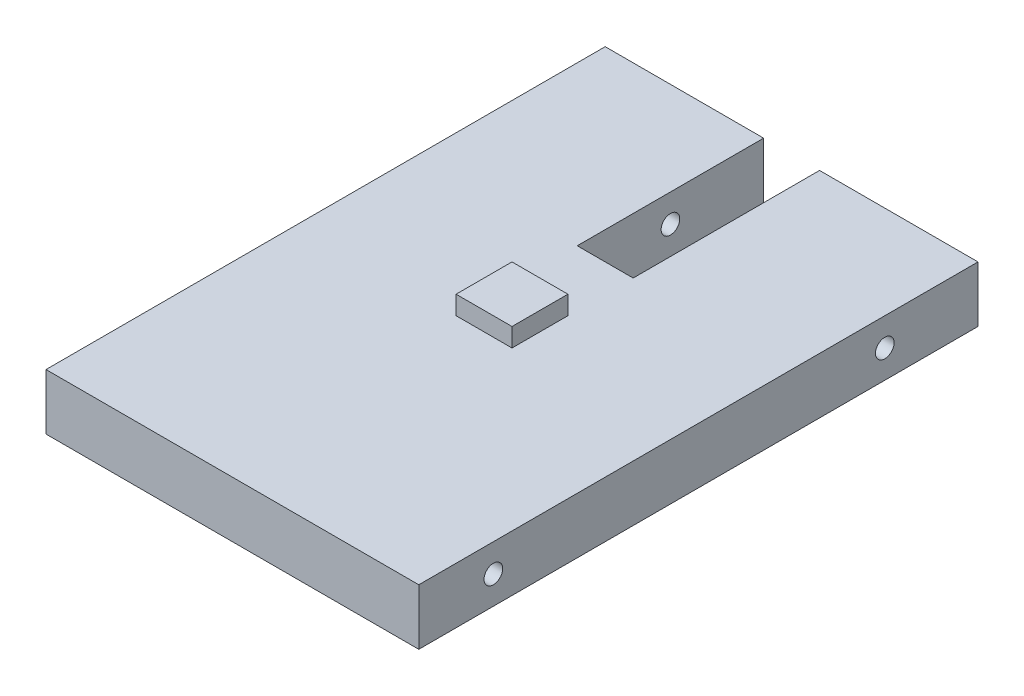
ISO-10303-21;
HEADER;
FILE_DESCRIPTION(('STEP AP214'),'2;1');
FILE_NAME('part.step','',(''),(''),'','','');
FILE_SCHEMA(('AUTOMOTIVE_DESIGN { 1 0 10303 214 1 1 1 1 }'));
ENDSEC;
DATA;
#1=APPLICATION_CONTEXT('core data for automotive mechanical design processes');
#2=APPLICATION_PROTOCOL_DEFINITION('international standard','automotive_design',2000,#1);
#3=PRODUCT_CONTEXT('',#1,'mechanical');
#4=PRODUCT('Part','Part','',(#3));
#5=PRODUCT_RELATED_PRODUCT_CATEGORY('part','',(#4));
#6=PRODUCT_DEFINITION_FORMATION('','',#4);
#7=PRODUCT_DEFINITION_CONTEXT('part definition',#1,'design');
#8=PRODUCT_DEFINITION('design','',#6,#7);
#9=PRODUCT_DEFINITION_SHAPE('','',#8);
#10=(LENGTH_UNIT() NAMED_UNIT(*) SI_UNIT(.MILLI.,.METRE.));
#11=(NAMED_UNIT(*) PLANE_ANGLE_UNIT() SI_UNIT($,.RADIAN.));
#12=(NAMED_UNIT(*) SI_UNIT($,.STERADIAN.) SOLID_ANGLE_UNIT());
#13=UNCERTAINTY_MEASURE_WITH_UNIT(LENGTH_MEASURE(1.E-05),#10,'distance_accuracy_value','');
#14=(GEOMETRIC_REPRESENTATION_CONTEXT(3) GLOBAL_UNCERTAINTY_ASSIGNED_CONTEXT((#13)) GLOBAL_UNIT_ASSIGNED_CONTEXT((#10,
#11,#12)) REPRESENTATION_CONTEXT('',''));
#15=CARTESIAN_POINT('',(0.,0.,0.));
#16=DIRECTION('',(0.,0.,1.));
#17=DIRECTION('',(1.,0.,0.));
#18=AXIS2_PLACEMENT_3D('',#15,#16,#17);
#19=CARTESIAN_POINT('',(0.,30.,0.));
#20=DIRECTION('',(0.,1.,0.));
#21=DIRECTION('',(0.,0.,1.));
#22=AXIS2_PLACEMENT_3D('',#19,#20,#21);
#23=PLANE('',#22);
#24=DIRECTION('',(-1.,0.,0.));
#25=VECTOR('',#24,1.);
#26=CARTESIAN_POINT('',(15.,30.,-150.));
#27=LINE('',#26,#25);
#28=CARTESIAN_POINT('',(100.,30.,-150.));
#29=VERTEX_POINT('',#28);
#30=CARTESIAN_POINT('',(15.,30.,-150.));
#31=VERTEX_POINT('',#30);
#32=EDGE_CURVE('E160',#29,#31,#27,.T.);
#33=ORIENTED_EDGE('',*,*,#32,.T.);
#34=DIRECTION('',(0.,0.,1.));
#35=VECTOR('',#34,1.);
#36=CARTESIAN_POINT('',(15.,30.,-50.));
#37=LINE('',#36,#35);
#38=CARTESIAN_POINT('',(15.,30.,-50.));
#39=VERTEX_POINT('',#38);
#40=EDGE_CURVE('E100',#31,#39,#37,.T.);
#41=ORIENTED_EDGE('',*,*,#40,.T.);
#42=DIRECTION('',(-1.,0.,0.));
#43=VECTOR('',#42,1.);
#44=CARTESIAN_POINT('',(-15.,30.,-50.));
#45=LINE('',#44,#43);
#46=CARTESIAN_POINT('',(-15.,30.,-50.));
#47=VERTEX_POINT('',#46);
#48=EDGE_CURVE('E195',#39,#47,#45,.T.);
#49=ORIENTED_EDGE('',*,*,#48,.T.);
#50=DIRECTION('',(0.,0.,-1.));
#51=VECTOR('',#50,1.);
#52=CARTESIAN_POINT('',(-15.,30.,-150.));
#53=LINE('',#52,#51);
#54=CARTESIAN_POINT('',(-15.,30.,-150.));
#55=VERTEX_POINT('',#54);
#56=EDGE_CURVE('E197',#47,#55,#53,.T.);
#57=ORIENTED_EDGE('',*,*,#56,.T.);
#58=DIRECTION('',(-1.,0.,0.));
#59=VECTOR('',#58,1.);
#60=CARTESIAN_POINT('',(-100.,30.,-150.));
#61=LINE('',#60,#59);
#62=CARTESIAN_POINT('',(-100.,30.,-150.));
#63=VERTEX_POINT('',#62);
#64=EDGE_CURVE('E123',#55,#63,#61,.T.);
#65=ORIENTED_EDGE('',*,*,#64,.T.);
#66=DIRECTION('',(0.,0.,1.));
#67=VECTOR('',#66,1.);
#68=CARTESIAN_POINT('',(-100.,30.,150.));
#69=LINE('',#68,#67);
#70=CARTESIAN_POINT('',(-100.,30.,150.));
#71=VERTEX_POINT('',#70);
#72=EDGE_CURVE('E116',#63,#71,#69,.T.);
#73=ORIENTED_EDGE('',*,*,#72,.T.);
#74=DIRECTION('',(1.,0.,0.));
#75=VECTOR('',#74,1.);
#76=CARTESIAN_POINT('',(-100.,30.,150.));
#77=LINE('',#76,#75);
#78=CARTESIAN_POINT('',(100.,30.,150.));
#79=VERTEX_POINT('',#78);
#80=EDGE_CURVE('E120',#71,#79,#77,.T.);
#81=ORIENTED_EDGE('',*,*,#80,.T.);
#82=DIRECTION('',(0.,0.,-1.));
#83=VECTOR('',#82,1.);
#84=CARTESIAN_POINT('',(100.,30.,150.));
#85=LINE('',#84,#83);
#86=EDGE_CURVE('E59',#79,#29,#85,.T.);
#87=ORIENTED_EDGE('',*,*,#86,.T.);
#88=EDGE_LOOP('',(#33,#41,#49,#57,#65,#73,#81,#87));
#89=FACE_BOUND('',#88,.T.);
#90=DIRECTION('',(-1.,0.,0.));
#91=VECTOR('',#90,1.);
#92=CARTESIAN_POINT('',(-15.,30.,-15.));
#93=LINE('',#92,#91);
#94=CARTESIAN_POINT('',(15.,30.,-15.));
#95=VERTEX_POINT('',#94);
#96=CARTESIAN_POINT('',(-15.,30.,-15.));
#97=VERTEX_POINT('',#96);
#98=EDGE_CURVE('E415',#95,#97,#93,.T.);
#99=ORIENTED_EDGE('',*,*,#98,.F.);
#100=DIRECTION('',(0.,0.,-1.));
#101=VECTOR('',#100,1.);
#102=CARTESIAN_POINT('',(15.,30.,15.));
#103=LINE('',#102,#101);
#104=CARTESIAN_POINT('',(15.,30.,15.));
#105=VERTEX_POINT('',#104);
#106=EDGE_CURVE('E400',#105,#95,#103,.T.);
#107=ORIENTED_EDGE('',*,*,#106,.F.);
#108=DIRECTION('',(1.,0.,0.));
#109=VECTOR('',#108,1.);
#110=CARTESIAN_POINT('',(-15.,30.,15.));
#111=LINE('',#110,#109);
#112=CARTESIAN_POINT('',(-15.,30.,15.));
#113=VERTEX_POINT('',#112);
#114=EDGE_CURVE('E394',#113,#105,#111,.T.);
#115=ORIENTED_EDGE('',*,*,#114,.F.);
#116=DIRECTION('',(0.,0.,1.));
#117=VECTOR('',#116,1.);
#118=CARTESIAN_POINT('',(-15.,30.,15.));
#119=LINE('',#118,#117);
#120=EDGE_CURVE('E413',#97,#113,#119,.T.);
#121=ORIENTED_EDGE('',*,*,#120,.F.);
#122=EDGE_LOOP('',(#99,#107,#115,#121));
#123=FACE_BOUND('',#122,.T.);
#124=ADVANCED_FACE('F33',(#89,#123),#23,.T.);
#125=CARTESIAN_POINT('',(15.,30.,-150.));
#126=DIRECTION('',(0.,0.,1.));
#127=DIRECTION('',(1.,0.,0.));
#128=AXIS2_PLACEMENT_3D('',#125,#126,#127);
#129=PLANE('',#128);
#130=DIRECTION('',(-1.,0.,0.));
#131=VECTOR('',#130,1.);
#132=CARTESIAN_POINT('',(15.,0.,-150.));
#133=LINE('',#132,#131);
#134=CARTESIAN_POINT('',(100.,0.,-150.));
#135=VERTEX_POINT('',#134);
#136=CARTESIAN_POINT('',(15.,0.,-150.));
#137=VERTEX_POINT('',#136);
#138=EDGE_CURVE('E144',#135,#137,#133,.T.);
#139=ORIENTED_EDGE('',*,*,#138,.T.);
#140=DIRECTION('',(0.,-1.,0.));
#141=VECTOR('',#140,1.);
#142=CARTESIAN_POINT('',(15.,30.,-150.));
#143=LINE('',#142,#141);
#144=EDGE_CURVE('E11',#31,#137,#143,.T.);
#145=ORIENTED_EDGE('',*,*,#144,.F.);
#146=ORIENTED_EDGE('',*,*,#32,.F.);
#147=DIRECTION('',(0.,-1.,0.));
#148=VECTOR('',#147,1.);
#149=CARTESIAN_POINT('',(100.,30.,-150.));
#150=LINE('',#149,#148);
#151=EDGE_CURVE('E140',#29,#135,#150,.T.);
#152=ORIENTED_EDGE('',*,*,#151,.T.);
#153=EDGE_LOOP('',(#139,#145,#146,#152));
#154=FACE_BOUND('',#153,.T.);
#155=ADVANCED_FACE('F35',(#154),#129,.F.);
#156=CARTESIAN_POINT('',(15.,30.,-50.));
#157=DIRECTION('',(1.,0.,0.));
#158=DIRECTION('',(0.,0.,-1.));
#159=AXIS2_PLACEMENT_3D('',#156,#157,#158);
#160=PLANE('',#159);
#161=CARTESIAN_POINT('',(15.,15.,-100.));
#162=DIRECTION('',(1.,0.,0.));
#163=DIRECTION('',(0.,0.,-1.));
#164=AXIS2_PLACEMENT_3D('',#161,#162,#163);
#165=CIRCLE('',#164,5.);
#166=CARTESIAN_POINT('',(15.,15.,-105.));
#167=VERTEX_POINT('',#166);
#168=EDGE_CURVE('E148',#167,#167,#165,.T.);
#169=ORIENTED_EDGE('',*,*,#168,.T.);
#170=EDGE_LOOP('',(#169));
#171=FACE_BOUND('',#170,.T.);
#172=DIRECTION('',(0.,0.,1.));
#173=VECTOR('',#172,1.);
#174=CARTESIAN_POINT('',(15.,0.,-50.));
#175=LINE('',#174,#173);
#176=CARTESIAN_POINT('',(15.,0.,-50.));
#177=VERTEX_POINT('',#176);
#178=EDGE_CURVE('E147',#137,#177,#175,.T.);
#179=ORIENTED_EDGE('',*,*,#178,.T.);
#180=DIRECTION('',(0.,-1.,0.));
#181=VECTOR('',#180,1.);
#182=CARTESIAN_POINT('',(15.,30.,-50.));
#183=LINE('',#182,#181);
#184=EDGE_CURVE('E42',#39,#177,#183,.T.);
#185=ORIENTED_EDGE('',*,*,#184,.F.);
#186=ORIENTED_EDGE('',*,*,#40,.F.);
#187=ORIENTED_EDGE('',*,*,#144,.T.);
#188=EDGE_LOOP('',(#179,#185,#186,#187));
#189=FACE_BOUND('',#188,.T.);
#190=ADVANCED_FACE('F215',(#171,#189),#160,.F.);
#191=CARTESIAN_POINT('',(-15.,30.,-50.));
#192=DIRECTION('',(0.,0.,1.));
#193=DIRECTION('',(1.,0.,0.));
#194=AXIS2_PLACEMENT_3D('',#191,#192,#193);
#195=PLANE('',#194);
#196=DIRECTION('',(-1.,0.,0.));
#197=VECTOR('',#196,1.);
#198=CARTESIAN_POINT('',(-15.,0.,-50.));
#199=LINE('',#198,#197);
#200=CARTESIAN_POINT('',(-15.,0.,-50.));
#201=VERTEX_POINT('',#200);
#202=EDGE_CURVE('E150',#177,#201,#199,.T.);
#203=ORIENTED_EDGE('',*,*,#202,.T.);
#204=DIRECTION('',(0.,-1.,0.));
#205=VECTOR('',#204,1.);
#206=CARTESIAN_POINT('',(-15.,30.,-50.));
#207=LINE('',#206,#205);
#208=EDGE_CURVE('E167',#47,#201,#207,.T.);
#209=ORIENTED_EDGE('',*,*,#208,.F.);
#210=ORIENTED_EDGE('',*,*,#48,.F.);
#211=ORIENTED_EDGE('',*,*,#184,.T.);
#212=EDGE_LOOP('',(#203,#209,#210,#211));
#213=FACE_BOUND('',#212,.T.);
#214=ADVANCED_FACE('F218',(#213),#195,.F.);
#215=CARTESIAN_POINT('',(-15.,30.,-150.));
#216=DIRECTION('',(-1.,0.,0.));
#217=DIRECTION('',(0.,0.,1.));
#218=AXIS2_PLACEMENT_3D('',#215,#216,#217);
#219=PLANE('',#218);
#220=CARTESIAN_POINT('',(-15.,15.,-100.));
#221=DIRECTION('',(-1.,0.,0.));
#222=DIRECTION('',(0.,0.,1.));
#223=AXIS2_PLACEMENT_3D('',#220,#221,#222);
#224=CIRCLE('',#223,5.);
#225=CARTESIAN_POINT('',(-15.,15.,-95.));
#226=VERTEX_POINT('',#225);
#227=EDGE_CURVE('E177',#226,#226,#224,.T.);
#228=ORIENTED_EDGE('',*,*,#227,.T.);
#229=EDGE_LOOP('',(#228));
#230=FACE_BOUND('',#229,.T.);
#231=DIRECTION('',(0.,0.,-1.));
#232=VECTOR('',#231,1.);
#233=CARTESIAN_POINT('',(-15.,0.,-150.));
#234=LINE('',#233,#232);
#235=CARTESIAN_POINT('',(-15.,0.,-150.));
#236=VERTEX_POINT('',#235);
#237=EDGE_CURVE('E152',#201,#236,#234,.T.);
#238=ORIENTED_EDGE('',*,*,#237,.T.);
#239=DIRECTION('',(0.,-1.,0.));
#240=VECTOR('',#239,1.);
#241=CARTESIAN_POINT('',(-15.,30.,-150.));
#242=LINE('',#241,#240);
#243=EDGE_CURVE('E164',#55,#236,#242,.T.);
#244=ORIENTED_EDGE('',*,*,#243,.F.);
#245=ORIENTED_EDGE('',*,*,#56,.F.);
#246=ORIENTED_EDGE('',*,*,#208,.T.);
#247=EDGE_LOOP('',(#238,#244,#245,#246));
#248=FACE_BOUND('',#247,.T.);
#249=ADVANCED_FACE('F203',(#230,#248),#219,.F.);
#250=CARTESIAN_POINT('',(-100.,30.,-150.));
#251=DIRECTION('',(0.,0.,1.));
#252=DIRECTION('',(1.,0.,0.));
#253=AXIS2_PLACEMENT_3D('',#250,#251,#252);
#254=PLANE('',#253);
#255=DIRECTION('',(-1.,0.,0.));
#256=VECTOR('',#255,1.);
#257=CARTESIAN_POINT('',(-100.,0.,-150.));
#258=LINE('',#257,#256);
#259=CARTESIAN_POINT('',(-100.,0.,-150.));
#260=VERTEX_POINT('',#259);
#261=EDGE_CURVE('E154',#236,#260,#258,.T.);
#262=ORIENTED_EDGE('',*,*,#261,.T.);
#263=DIRECTION('',(0.,-1.,0.));
#264=VECTOR('',#263,1.);
#265=CARTESIAN_POINT('',(-100.,30.,-150.));
#266=LINE('',#265,#264);
#267=EDGE_CURVE('E135',#63,#260,#266,.T.);
#268=ORIENTED_EDGE('',*,*,#267,.F.);
#269=ORIENTED_EDGE('',*,*,#64,.F.);
#270=ORIENTED_EDGE('',*,*,#243,.T.);
#271=EDGE_LOOP('',(#262,#268,#269,#270));
#272=FACE_BOUND('',#271,.T.);
#273=ADVANCED_FACE('F207',(#272),#254,.F.);
#274=CARTESIAN_POINT('',(-100.,30.,150.));
#275=DIRECTION('',(1.,0.,0.));
#276=DIRECTION('',(0.,0.,-1.));
#277=AXIS2_PLACEMENT_3D('',#274,#275,#276);
#278=PLANE('',#277);
#279=CARTESIAN_POINT('',(-100.,15.,-100.));
#280=DIRECTION('',(-1.,0.,0.));
#281=DIRECTION('',(0.,0.,1.));
#282=AXIS2_PLACEMENT_3D('',#279,#280,#281);
#283=CIRCLE('',#282,5.);
#284=CARTESIAN_POINT('',(-100.,15.,-95.));
#285=VERTEX_POINT('',#284);
#286=EDGE_CURVE('E173',#285,#285,#283,.T.);
#287=ORIENTED_EDGE('',*,*,#286,.F.);
#288=EDGE_LOOP('',(#287));
#289=FACE_BOUND('',#288,.T.);
#290=CARTESIAN_POINT('',(-100.,15.,110.));
#291=DIRECTION('',(-1.,0.,0.));
#292=DIRECTION('',(0.,0.,1.));
#293=AXIS2_PLACEMENT_3D('',#290,#291,#292);
#294=CIRCLE('',#293,5.);
#295=CARTESIAN_POINT('',(-100.,15.,115.));
#296=VERTEX_POINT('',#295);
#297=EDGE_CURVE('E179',#296,#296,#294,.T.);
#298=ORIENTED_EDGE('',*,*,#297,.F.);
#299=EDGE_LOOP('',(#298));
#300=FACE_BOUND('',#299,.T.);
#301=DIRECTION('',(0.,0.,1.));
#302=VECTOR('',#301,1.);
#303=CARTESIAN_POINT('',(-100.,0.,150.));
#304=LINE('',#303,#302);
#305=CARTESIAN_POINT('',(-100.,0.,150.));
#306=VERTEX_POINT('',#305);
#307=EDGE_CURVE('E132',#260,#306,#304,.T.);
#308=ORIENTED_EDGE('',*,*,#307,.T.);
#309=DIRECTION('',(0.,-1.,0.));
#310=VECTOR('',#309,1.);
#311=CARTESIAN_POINT('',(-100.,30.,150.));
#312=LINE('',#311,#310);
#313=EDGE_CURVE('E129',#71,#306,#312,.T.);
#314=ORIENTED_EDGE('',*,*,#313,.F.);
#315=ORIENTED_EDGE('',*,*,#72,.F.);
#316=ORIENTED_EDGE('',*,*,#267,.T.);
#317=EDGE_LOOP('',(#308,#314,#315,#316));
#318=FACE_BOUND('',#317,.T.);
#319=ADVANCED_FACE('F130',(#289,#300,#318),#278,.F.);
#320=CARTESIAN_POINT('',(-100.,30.,150.));
#321=DIRECTION('',(0.,0.,-1.));
#322=DIRECTION('',(-1.,0.,0.));
#323=AXIS2_PLACEMENT_3D('',#320,#321,#322);
#324=PLANE('',#323);
#325=DIRECTION('',(1.,0.,0.));
#326=VECTOR('',#325,1.);
#327=CARTESIAN_POINT('',(-100.,0.,150.));
#328=LINE('',#327,#326);
#329=CARTESIAN_POINT('',(100.,0.,150.));
#330=VERTEX_POINT('',#329);
#331=EDGE_CURVE('E157',#306,#330,#328,.T.);
#332=ORIENTED_EDGE('',*,*,#331,.T.);
#333=DIRECTION('',(0.,-1.,0.));
#334=VECTOR('',#333,1.);
#335=CARTESIAN_POINT('',(100.,30.,150.));
#336=LINE('',#335,#334);
#337=EDGE_CURVE('E136',#79,#330,#336,.T.);
#338=ORIENTED_EDGE('',*,*,#337,.F.);
#339=ORIENTED_EDGE('',*,*,#80,.F.);
#340=ORIENTED_EDGE('',*,*,#313,.T.);
#341=EDGE_LOOP('',(#332,#338,#339,#340));
#342=FACE_BOUND('',#341,.T.);
#343=ADVANCED_FACE('F138',(#342),#324,.F.);
#344=CARTESIAN_POINT('',(100.,30.,150.));
#345=DIRECTION('',(-1.,0.,0.));
#346=DIRECTION('',(0.,0.,1.));
#347=AXIS2_PLACEMENT_3D('',#344,#345,#346);
#348=PLANE('',#347);
#349=CARTESIAN_POINT('',(100.,15.,-100.));
#350=DIRECTION('',(-1.,0.,0.));
#351=DIRECTION('',(0.,0.,1.));
#352=AXIS2_PLACEMENT_3D('',#349,#350,#351);
#353=CIRCLE('',#352,5.);
#354=CARTESIAN_POINT('',(100.,15.,-95.));
#355=VERTEX_POINT('',#354);
#356=EDGE_CURVE('E37',#355,#355,#353,.T.);
#357=ORIENTED_EDGE('',*,*,#356,.T.);
#358=EDGE_LOOP('',(#357));
#359=FACE_BOUND('',#358,.T.);
#360=CARTESIAN_POINT('',(100.,15.,110.));
#361=DIRECTION('',(-1.,0.,0.));
#362=DIRECTION('',(0.,0.,1.));
#363=AXIS2_PLACEMENT_3D('',#360,#361,#362);
#364=CIRCLE('',#363,5.);
#365=CARTESIAN_POINT('',(100.,15.,115.));
#366=VERTEX_POINT('',#365);
#367=EDGE_CURVE('E171',#366,#366,#364,.T.);
#368=ORIENTED_EDGE('',*,*,#367,.T.);
#369=EDGE_LOOP('',(#368));
#370=FACE_BOUND('',#369,.T.);
#371=DIRECTION('',(0.,0.,-1.));
#372=VECTOR('',#371,1.);
#373=CARTESIAN_POINT('',(100.,0.,150.));
#374=LINE('',#373,#372);
#375=EDGE_CURVE('E92',#330,#135,#374,.T.);
#376=ORIENTED_EDGE('',*,*,#375,.T.);
#377=ORIENTED_EDGE('',*,*,#151,.F.);
#378=ORIENTED_EDGE('',*,*,#86,.F.);
#379=ORIENTED_EDGE('',*,*,#337,.T.);
#380=EDGE_LOOP('',(#376,#377,#378,#379));
#381=FACE_BOUND('',#380,.T.);
#382=ADVANCED_FACE('F211',(#359,#370,#381),#348,.F.);
#383=CARTESIAN_POINT('',(0.,0.,0.));
#384=DIRECTION('',(0.,1.,0.));
#385=DIRECTION('',(0.,0.,1.));
#386=AXIS2_PLACEMENT_3D('',#383,#384,#385);
#387=PLANE('',#386);
#388=ORIENTED_EDGE('',*,*,#138,.F.);
#389=ORIENTED_EDGE('',*,*,#375,.F.);
#390=ORIENTED_EDGE('',*,*,#331,.F.);
#391=ORIENTED_EDGE('',*,*,#307,.F.);
#392=ORIENTED_EDGE('',*,*,#261,.F.);
#393=ORIENTED_EDGE('',*,*,#237,.F.);
#394=ORIENTED_EDGE('',*,*,#202,.F.);
#395=ORIENTED_EDGE('',*,*,#178,.F.);
#396=EDGE_LOOP('',(#388,#389,#390,#391,#392,#393,#394,#395));
#397=FACE_BOUND('',#396,.T.);
#398=ADVANCED_FACE('F210',(#397),#387,.F.);
#399=CARTESIAN_POINT('',(235.,15.,110.));
#400=DIRECTION('',(-1.,0.,0.));
#401=DIRECTION('',(0.,0.,1.));
#402=AXIS2_PLACEMENT_3D('',#399,#400,#401);
#403=CYLINDRICAL_SURFACE('',#402,5.);
#404=ORIENTED_EDGE('',*,*,#297,.T.);
#405=EDGE_LOOP('',(#404));
#406=FACE_BOUND('',#405,.T.);
#407=ORIENTED_EDGE('',*,*,#367,.F.);
#408=EDGE_LOOP('',(#407));
#409=FACE_BOUND('',#408,.T.);
#410=ADVANCED_FACE('F235',(#406,#409),#403,.F.);
#411=CARTESIAN_POINT('',(235.,15.,-100.));
#412=DIRECTION('',(-1.,0.,0.));
#413=DIRECTION('',(0.,0.,1.));
#414=AXIS2_PLACEMENT_3D('',#411,#412,#413);
#415=CYLINDRICAL_SURFACE('',#414,5.);
#416=ORIENTED_EDGE('',*,*,#356,.F.);
#417=EDGE_LOOP('',(#416));
#418=FACE_BOUND('',#417,.T.);
#419=ORIENTED_EDGE('',*,*,#168,.F.);
#420=EDGE_LOOP('',(#419));
#421=FACE_BOUND('',#420,.T.);
#422=ADVANCED_FACE('F275',(#418,#421),#415,.F.);
#423=ORIENTED_EDGE('',*,*,#286,.T.);
#424=EDGE_LOOP('',(#423));
#425=FACE_BOUND('',#424,.T.);
#426=ORIENTED_EDGE('',*,*,#227,.F.);
#427=EDGE_LOOP('',(#426));
#428=FACE_BOUND('',#427,.T.);
#429=ADVANCED_FACE('F282',(#425,#428),#415,.F.);
#430=CARTESIAN_POINT('',(15.,40.,15.));
#431=DIRECTION('',(-1.,0.,0.));
#432=DIRECTION('',(0.,0.,1.));
#433=AXIS2_PLACEMENT_3D('',#430,#431,#432);
#434=PLANE('',#433);
#435=ORIENTED_EDGE('',*,*,#106,.T.);
#436=DIRECTION('',(0.,-1.,0.));
#437=VECTOR('',#436,1.);
#438=CARTESIAN_POINT('',(15.,40.,-15.));
#439=LINE('',#438,#437);
#440=CARTESIAN_POINT('',(15.,40.,-15.));
#441=VERTEX_POINT('',#440);
#442=EDGE_CURVE('E184',#441,#95,#439,.T.);
#443=ORIENTED_EDGE('',*,*,#442,.F.);
#444=DIRECTION('',(0.,0.,-1.));
#445=VECTOR('',#444,1.);
#446=CARTESIAN_POINT('',(15.,40.,15.));
#447=LINE('',#446,#445);
#448=CARTESIAN_POINT('',(15.,40.,15.));
#449=VERTEX_POINT('',#448);
#450=EDGE_CURVE('E383',#449,#441,#447,.T.);
#451=ORIENTED_EDGE('',*,*,#450,.F.);
#452=DIRECTION('',(0.,-1.,0.));
#453=VECTOR('',#452,1.);
#454=CARTESIAN_POINT('',(15.,40.,15.));
#455=LINE('',#454,#453);
#456=EDGE_CURVE('E408',#449,#105,#455,.T.);
#457=ORIENTED_EDGE('',*,*,#456,.T.);
#458=EDGE_LOOP('',(#435,#443,#451,#457));
#459=FACE_BOUND('',#458,.T.);
#460=ADVANCED_FACE('F289',(#459),#434,.F.);
#461=CARTESIAN_POINT('',(-15.,40.,-15.));
#462=DIRECTION('',(0.,0.,1.));
#463=DIRECTION('',(1.,0.,0.));
#464=AXIS2_PLACEMENT_3D('',#461,#462,#463);
#465=PLANE('',#464);
#466=ORIENTED_EDGE('',*,*,#98,.T.);
#467=DIRECTION('',(0.,-1.,0.));
#468=VECTOR('',#467,1.);
#469=CARTESIAN_POINT('',(-15.,40.,-15.));
#470=LINE('',#469,#468);
#471=CARTESIAN_POINT('',(-15.,40.,-15.));
#472=VERTEX_POINT('',#471);
#473=EDGE_CURVE('E403',#472,#97,#470,.T.);
#474=ORIENTED_EDGE('',*,*,#473,.F.);
#475=DIRECTION('',(-1.,0.,0.));
#476=VECTOR('',#475,1.);
#477=CARTESIAN_POINT('',(-15.,40.,-15.));
#478=LINE('',#477,#476);
#479=EDGE_CURVE('E388',#441,#472,#478,.T.);
#480=ORIENTED_EDGE('',*,*,#479,.F.);
#481=ORIENTED_EDGE('',*,*,#442,.T.);
#482=EDGE_LOOP('',(#466,#474,#480,#481));
#483=FACE_BOUND('',#482,.T.);
#484=ADVANCED_FACE('F295',(#483),#465,.F.);
#485=CARTESIAN_POINT('',(-15.,40.,15.));
#486=DIRECTION('',(1.,0.,0.));
#487=DIRECTION('',(0.,0.,-1.));
#488=AXIS2_PLACEMENT_3D('',#485,#486,#487);
#489=PLANE('',#488);
#490=ORIENTED_EDGE('',*,*,#120,.T.);
#491=DIRECTION('',(0.,-1.,0.));
#492=VECTOR('',#491,1.);
#493=CARTESIAN_POINT('',(-15.,40.,15.));
#494=LINE('',#493,#492);
#495=CARTESIAN_POINT('',(-15.,40.,15.));
#496=VERTEX_POINT('',#495);
#497=EDGE_CURVE('E50',#496,#113,#494,.T.);
#498=ORIENTED_EDGE('',*,*,#497,.F.);
#499=DIRECTION('',(0.,0.,1.));
#500=VECTOR('',#499,1.);
#501=CARTESIAN_POINT('',(-15.,40.,15.));
#502=LINE('',#501,#500);
#503=EDGE_CURVE('E419',#472,#496,#502,.T.);
#504=ORIENTED_EDGE('',*,*,#503,.F.);
#505=ORIENTED_EDGE('',*,*,#473,.T.);
#506=EDGE_LOOP('',(#490,#498,#504,#505));
#507=FACE_BOUND('',#506,.T.);
#508=ADVANCED_FACE('F303',(#507),#489,.F.);
#509=CARTESIAN_POINT('',(-15.,40.,15.));
#510=DIRECTION('',(0.,0.,-1.));
#511=DIRECTION('',(-1.,0.,0.));
#512=AXIS2_PLACEMENT_3D('',#509,#510,#511);
#513=PLANE('',#512);
#514=ORIENTED_EDGE('',*,*,#114,.T.);
#515=ORIENTED_EDGE('',*,*,#456,.F.);
#516=DIRECTION('',(1.,0.,0.));
#517=VECTOR('',#516,1.);
#518=CARTESIAN_POINT('',(-15.,40.,15.));
#519=LINE('',#518,#517);
#520=EDGE_CURVE('E390',#496,#449,#519,.T.);
#521=ORIENTED_EDGE('',*,*,#520,.F.);
#522=ORIENTED_EDGE('',*,*,#497,.T.);
#523=EDGE_LOOP('',(#514,#515,#521,#522));
#524=FACE_BOUND('',#523,.T.);
#525=ADVANCED_FACE('F311',(#524),#513,.F.);
#526=CARTESIAN_POINT('',(0.,40.,0.));
#527=DIRECTION('',(0.,-1.,0.));
#528=DIRECTION('',(0.,0.,-1.));
#529=AXIS2_PLACEMENT_3D('',#526,#527,#528);
#530=PLANE('',#529);
#531=ORIENTED_EDGE('',*,*,#450,.T.);
#532=ORIENTED_EDGE('',*,*,#479,.T.);
#533=ORIENTED_EDGE('',*,*,#503,.T.);
#534=ORIENTED_EDGE('',*,*,#520,.T.);
#535=EDGE_LOOP('',(#531,#532,#533,#534));
#536=FACE_BOUND('',#535,.T.);
#537=ADVANCED_FACE('F319',(#536),#530,.F.);
#538=CLOSED_SHELL('',(#124,#155,#190,#214,#249,#273,#319,#343,#382,#398,#410,#422,#429,#460,
#484,#508,#525,#537));
#539=MANIFOLD_SOLID_BREP('B2',#538);
#540=ADVANCED_BREP_SHAPE_REPRESENTATION('',(#18,#539),#14);
#541=SHAPE_DEFINITION_REPRESENTATION(#9,#540);
ENDSEC;
END-ISO-10303-21;
